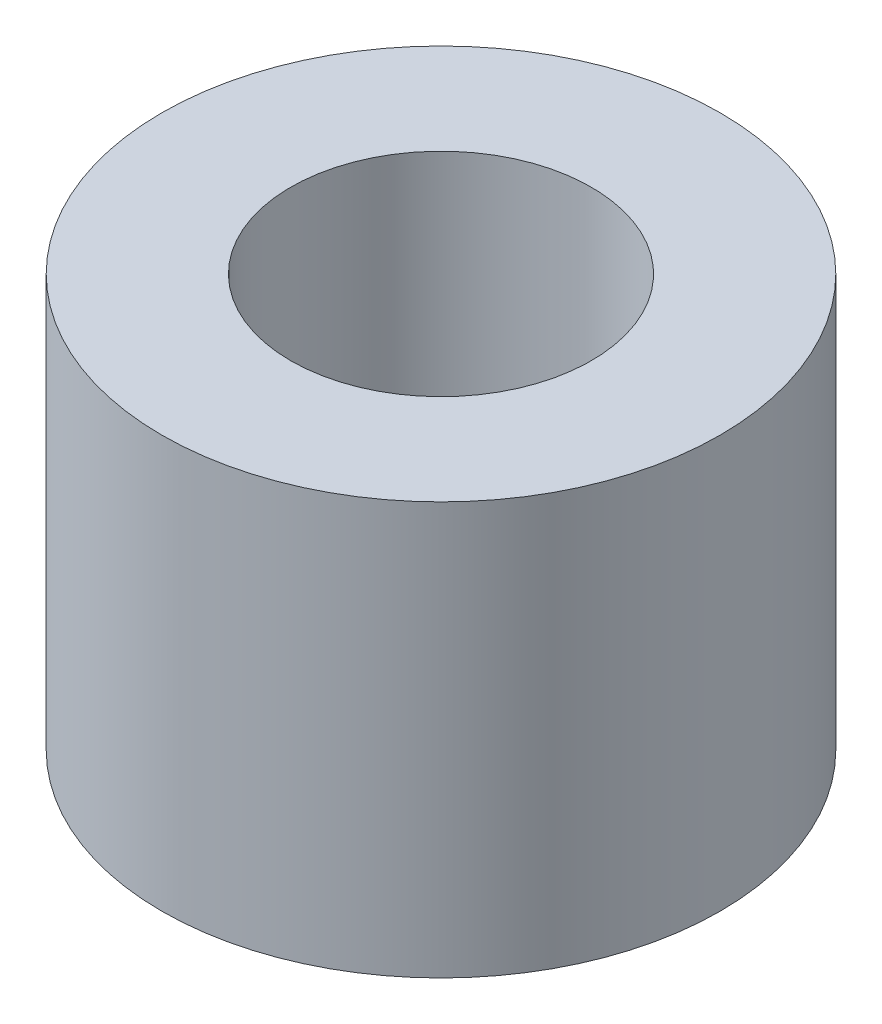
ISO-10303-21;
HEADER;
FILE_DESCRIPTION(('STEP AP214'),'2;1');
FILE_NAME('part.step','',(''),(''),'','','');
FILE_SCHEMA(('AUTOMOTIVE_DESIGN { 1 0 10303 214 1 1 1 1 }'));
ENDSEC;
DATA;
#1=APPLICATION_CONTEXT('core data for automotive mechanical design processes');
#2=APPLICATION_PROTOCOL_DEFINITION('international standard','automotive_design',2000,#1);
#3=PRODUCT_CONTEXT('',#1,'mechanical');
#4=PRODUCT('Part','Part','',(#3));
#5=PRODUCT_RELATED_PRODUCT_CATEGORY('part','',(#4));
#6=PRODUCT_DEFINITION_FORMATION('','',#4);
#7=PRODUCT_DEFINITION_CONTEXT('part definition',#1,'design');
#8=PRODUCT_DEFINITION('design','',#6,#7);
#9=PRODUCT_DEFINITION_SHAPE('','',#8);
#10=(LENGTH_UNIT() NAMED_UNIT(*) SI_UNIT(.MILLI.,.METRE.));
#11=(NAMED_UNIT(*) PLANE_ANGLE_UNIT() SI_UNIT($,.RADIAN.));
#12=(NAMED_UNIT(*) SI_UNIT($,.STERADIAN.) SOLID_ANGLE_UNIT());
#13=UNCERTAINTY_MEASURE_WITH_UNIT(LENGTH_MEASURE(1.E-05),#10,'distance_accuracy_value','');
#14=(GEOMETRIC_REPRESENTATION_CONTEXT(3) GLOBAL_UNCERTAINTY_ASSIGNED_CONTEXT((#13)) GLOBAL_UNIT_ASSIGNED_CONTEXT((#10,
#11,#12)) REPRESENTATION_CONTEXT('',''));
#15=CARTESIAN_POINT('',(0.,0.,0.));
#16=DIRECTION('',(0.,0.,1.));
#17=DIRECTION('',(1.,0.,0.));
#18=AXIS2_PLACEMENT_3D('',#15,#16,#17);
#19=CARTESIAN_POINT('',(0.,4.8,0.));
#20=DIRECTION('',(0.,1.,0.));
#21=DIRECTION('',(0.,0.,1.));
#22=AXIS2_PLACEMENT_3D('',#19,#20,#21);
#23=PLANE('',#22);
#24=CARTESIAN_POINT('',(0.,4.8,0.));
#25=DIRECTION('',(0.,1.,0.));
#26=DIRECTION('',(0.,0.,1.));
#27=AXIS2_PLACEMENT_3D('',#24,#25,#26);
#28=CIRCLE('',#27,3.25);
#29=CARTESIAN_POINT('',(0.,4.8,3.25));
#30=VERTEX_POINT('',#29);
#31=EDGE_CURVE('E10',#30,#30,#28,.T.);
#32=ORIENTED_EDGE('',*,*,#31,.T.);
#33=EDGE_LOOP('',(#32));
#34=FACE_BOUND('',#33,.T.);
#35=CARTESIAN_POINT('',(0.,4.8,0.));
#36=DIRECTION('',(0.,1.,0.));
#37=DIRECTION('',(0.,0.,1.));
#38=AXIS2_PLACEMENT_3D('',#35,#36,#37);
#39=CIRCLE('',#38,1.75);
#40=CARTESIAN_POINT('',(0.,4.8,1.75));
#41=VERTEX_POINT('',#40);
#42=EDGE_CURVE('E43',#41,#41,#39,.T.);
#43=ORIENTED_EDGE('',*,*,#42,.F.);
#44=EDGE_LOOP('',(#43));
#45=FACE_BOUND('',#44,.T.);
#46=ADVANCED_FACE('F32',(#34,#45),#23,.T.);
#47=CARTESIAN_POINT('',(0.,0.,0.));
#48=DIRECTION('',(0.,1.,0.));
#49=DIRECTION('',(0.,0.,1.));
#50=AXIS2_PLACEMENT_3D('',#47,#48,#49);
#51=PLANE('',#50);
#52=CARTESIAN_POINT('',(0.,0.,0.));
#53=DIRECTION('',(0.,1.,0.));
#54=DIRECTION('',(0.,0.,1.));
#55=AXIS2_PLACEMENT_3D('',#52,#53,#54);
#56=CIRCLE('',#55,3.25);
#57=CARTESIAN_POINT('',(0.,0.,3.25));
#58=VERTEX_POINT('',#57);
#59=EDGE_CURVE('E36',#58,#58,#56,.T.);
#60=ORIENTED_EDGE('',*,*,#59,.F.);
#61=EDGE_LOOP('',(#60));
#62=FACE_BOUND('',#61,.T.);
#63=CARTESIAN_POINT('',(0.,0.,0.));
#64=DIRECTION('',(0.,1.,0.));
#65=DIRECTION('',(0.,0.,1.));
#66=AXIS2_PLACEMENT_3D('',#63,#64,#65);
#67=CIRCLE('',#66,1.75);
#68=CARTESIAN_POINT('',(0.,0.,1.75));
#69=VERTEX_POINT('',#68);
#70=EDGE_CURVE('E45',#69,#69,#67,.T.);
#71=ORIENTED_EDGE('',*,*,#70,.T.);
#72=EDGE_LOOP('',(#71));
#73=FACE_BOUND('',#72,.T.);
#74=ADVANCED_FACE('F55',(#62,#73),#51,.F.);
#75=CARTESIAN_POINT('',(0.,4.8,0.));
#76=DIRECTION('',(0.,-1.,0.));
#77=DIRECTION('',(0.,0.,-1.));
#78=AXIS2_PLACEMENT_3D('',#75,#76,#77);
#79=CYLINDRICAL_SURFACE('',#78,3.25);
#80=ORIENTED_EDGE('',*,*,#31,.F.);
#81=EDGE_LOOP('',(#80));
#82=FACE_BOUND('',#81,.T.);
#83=ORIENTED_EDGE('',*,*,#59,.T.);
#84=EDGE_LOOP('',(#83));
#85=FACE_BOUND('',#84,.T.);
#86=ADVANCED_FACE('F34',(#82,#85),#79,.T.);
#87=CARTESIAN_POINT('',(0.,4.8,0.));
#88=DIRECTION('',(0.,-1.,0.));
#89=DIRECTION('',(0.,0.,-1.));
#90=AXIS2_PLACEMENT_3D('',#87,#88,#89);
#91=CYLINDRICAL_SURFACE('',#90,1.75);
#92=ORIENTED_EDGE('',*,*,#42,.T.);
#93=EDGE_LOOP('',(#92));
#94=FACE_BOUND('',#93,.T.);
#95=ORIENTED_EDGE('',*,*,#70,.F.);
#96=EDGE_LOOP('',(#95));
#97=FACE_BOUND('',#96,.T.);
#98=ADVANCED_FACE('F51',(#94,#97),#91,.F.);
#99=CLOSED_SHELL('',(#46,#74,#86,#98));
#100=MANIFOLD_SOLID_BREP('B2',#99);
#101=ADVANCED_BREP_SHAPE_REPRESENTATION('',(#18,#100),#14);
#102=SHAPE_DEFINITION_REPRESENTATION(#9,#101);
ENDSEC;
END-ISO-10303-21;
